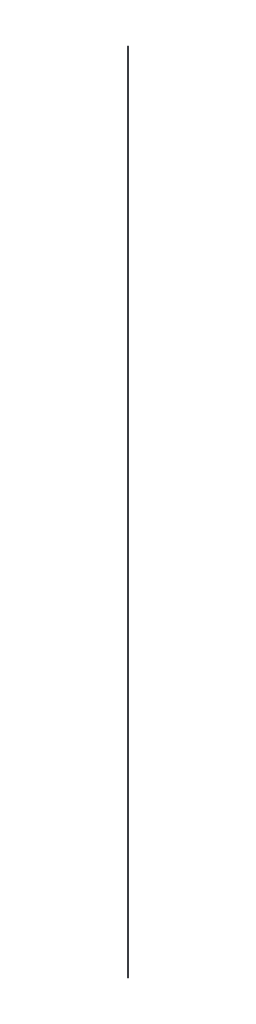
ISO-10303-21;
HEADER;
FILE_DESCRIPTION(('STEP AP214'),'2;1');
FILE_NAME('part.step','',(''),(''),'','','');
FILE_SCHEMA(('AUTOMOTIVE_DESIGN { 1 0 10303 214 1 1 1 1 }'));
ENDSEC;
DATA;
#1=APPLICATION_CONTEXT('core data for automotive mechanical design processes');
#2=APPLICATION_PROTOCOL_DEFINITION('international standard','automotive_design',2000,#1);
#3=PRODUCT_CONTEXT('',#1,'mechanical');
#4=PRODUCT('Part','Part','',(#3));
#5=PRODUCT_RELATED_PRODUCT_CATEGORY('part','',(#4));
#6=PRODUCT_DEFINITION_FORMATION('','',#4);
#7=PRODUCT_DEFINITION_CONTEXT('part definition',#1,'design');
#8=PRODUCT_DEFINITION('design','',#6,#7);
#9=PRODUCT_DEFINITION_SHAPE('','',#8);
#10=(LENGTH_UNIT() NAMED_UNIT(*) SI_UNIT(.MILLI.,.METRE.));
#11=(NAMED_UNIT(*) PLANE_ANGLE_UNIT() SI_UNIT($,.RADIAN.));
#12=(NAMED_UNIT(*) SI_UNIT($,.STERADIAN.) SOLID_ANGLE_UNIT());
#13=UNCERTAINTY_MEASURE_WITH_UNIT(LENGTH_MEASURE(1.E-05),#10,'distance_accuracy_value','');
#14=(GEOMETRIC_REPRESENTATION_CONTEXT(3) GLOBAL_UNCERTAINTY_ASSIGNED_CONTEXT((#13)) GLOBAL_UNIT_ASSIGNED_CONTEXT((#10,
#11,#12)) REPRESENTATION_CONTEXT('',''));
#15=CARTESIAN_POINT('',(0.,0.,0.));
#16=DIRECTION('',(0.,0.,1.));
#17=DIRECTION('',(1.,0.,0.));
#18=AXIS2_PLACEMENT_3D('',#15,#16,#17);
#19=CARTESIAN_POINT('',(0.,9000.,0.));
#20=DIRECTION('',(0.,-1.,0.));
#21=DIRECTION('',(0.,0.,-1.));
#22=AXIS2_PLACEMENT_3D('',#19,#20,#21);
#23=CYLINDRICAL_SURFACE('',#22,3.);
#24=CARTESIAN_POINT('',(0.,9000.,0.));
#25=DIRECTION('',(0.,1.,0.));
#26=DIRECTION('',(0.,0.,1.));
#27=AXIS2_PLACEMENT_3D('',#24,#25,#26);
#28=CIRCLE('',#27,3.);
#29=CARTESIAN_POINT('',(0.,9000.,3.));
#30=VERTEX_POINT('',#29);
#31=EDGE_CURVE('E10',#30,#30,#28,.T.);
#32=ORIENTED_EDGE('',*,*,#31,.F.);
#33=EDGE_LOOP('',(#32));
#34=FACE_BOUND('',#33,.T.);
#35=CARTESIAN_POINT('',(0.,0.,0.));
#36=DIRECTION('',(0.,1.,0.));
#37=DIRECTION('',(0.,0.,1.));
#38=AXIS2_PLACEMENT_3D('',#35,#36,#37);
#39=CIRCLE('',#38,3.);
#40=CARTESIAN_POINT('',(0.,0.,3.));
#41=VERTEX_POINT('',#40);
#42=EDGE_CURVE('E18',#41,#41,#39,.T.);
#43=ORIENTED_EDGE('',*,*,#42,.T.);
#44=EDGE_LOOP('',(#43));
#45=FACE_BOUND('',#44,.T.);
#46=ADVANCED_FACE('F15',(#34,#45),#23,.T.);
#47=CARTESIAN_POINT('',(0.,9000.,0.));
#48=DIRECTION('',(0.,1.,0.));
#49=DIRECTION('',(0.,0.,1.));
#50=AXIS2_PLACEMENT_3D('',#47,#48,#49);
#51=PLANE('',#50);
#52=ORIENTED_EDGE('',*,*,#31,.T.);
#53=EDGE_LOOP('',(#52));
#54=FACE_BOUND('',#53,.T.);
#55=ADVANCED_FACE('F30',(#54),#51,.T.);
#56=CARTESIAN_POINT('',(0.,0.,0.));
#57=DIRECTION('',(0.,1.,0.));
#58=DIRECTION('',(0.,0.,1.));
#59=AXIS2_PLACEMENT_3D('',#56,#57,#58);
#60=PLANE('',#59);
#61=ORIENTED_EDGE('',*,*,#42,.F.);
#62=EDGE_LOOP('',(#61));
#63=FACE_BOUND('',#62,.T.);
#64=ADVANCED_FACE('F28',(#63),#60,.F.);
#65=CLOSED_SHELL('',(#46,#55,#64));
#66=MANIFOLD_SOLID_BREP('B1',#65);
#67=ADVANCED_BREP_SHAPE_REPRESENTATION('',(#18,#66),#14);
#68=SHAPE_DEFINITION_REPRESENTATION(#9,#67);
ENDSEC;
END-ISO-10303-21;
